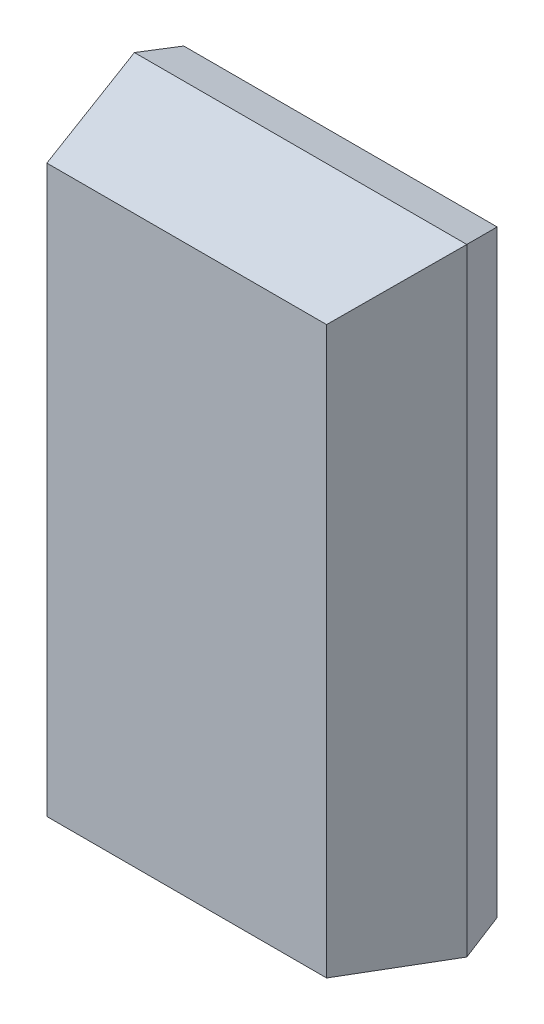
ISO-10303-21;
HEADER;
FILE_DESCRIPTION(('STEP AP214'),'2;1');
FILE_NAME('part.step','',(''),(''),'','','');
FILE_SCHEMA(('AUTOMOTIVE_DESIGN { 1 0 10303 214 1 1 1 1 }'));
ENDSEC;
DATA;
#1=APPLICATION_CONTEXT('core data for automotive mechanical design processes');
#2=APPLICATION_PROTOCOL_DEFINITION('international standard','automotive_design',2000,#1);
#3=PRODUCT_CONTEXT('',#1,'mechanical');
#4=PRODUCT('Part','Part','',(#3));
#5=PRODUCT_RELATED_PRODUCT_CATEGORY('part','',(#4));
#6=PRODUCT_DEFINITION_FORMATION('','',#4);
#7=PRODUCT_DEFINITION_CONTEXT('part definition',#1,'design');
#8=PRODUCT_DEFINITION('design','',#6,#7);
#9=PRODUCT_DEFINITION_SHAPE('','',#8);
#10=(LENGTH_UNIT() NAMED_UNIT(*) SI_UNIT(.MILLI.,.METRE.));
#11=(NAMED_UNIT(*) PLANE_ANGLE_UNIT() SI_UNIT($,.RADIAN.));
#12=(NAMED_UNIT(*) SI_UNIT($,.STERADIAN.) SOLID_ANGLE_UNIT());
#13=UNCERTAINTY_MEASURE_WITH_UNIT(LENGTH_MEASURE(1.E-05),#10,'distance_accuracy_value','');
#14=(GEOMETRIC_REPRESENTATION_CONTEXT(3) GLOBAL_UNCERTAINTY_ASSIGNED_CONTEXT((#13)) GLOBAL_UNIT_ASSIGNED_CONTEXT((#10,
#11,#12)) REPRESENTATION_CONTEXT('',''));
#15=CARTESIAN_POINT('',(0.,0.,0.));
#16=DIRECTION('',(0.,0.,1.));
#17=DIRECTION('',(1.,0.,0.));
#18=AXIS2_PLACEMENT_3D('',#15,#16,#17);
#19=CARTESIAN_POINT('',(24.4948179835691,22.0228286743183,1.63792220718919));
#20=DIRECTION('',(-4.37114089691456E-08,0.,1.));
#21=DIRECTION('',(-1.,-1.19248806385E-08,-4.37114089691456E-08));
#22=AXIS2_PLACEMENT_3D('',#19,#20,#21);
#23=PLANE('',#22);
#24=DIRECTION('',(1.19248806385E-08,-1.,0.));
#25=VECTOR('',#24,1.);
#26=CARTESIAN_POINT('',(23.0250618860082,22.0228286567916,1.63792214294408));
#27=LINE('',#26,#25);
#28=CARTESIAN_POINT('',(23.0250618505536,24.9959993884985,1.63792214294408));
#29=VERTEX_POINT('',#28);
#30=CARTESIAN_POINT('',(23.0250619214629,19.0496579250846,1.63792214294408));
#31=VERTEX_POINT('',#30);
#32=EDGE_CURVE('E162',#29,#31,#27,.T.);
#33=ORIENTED_EDGE('',*,*,#32,.T.);
#34=DIRECTION('',(1.,1.19248806729397E-08,4.3711409122211E-08));
#35=VECTOR('',#34,1.);
#36=CARTESIAN_POINT('',(24.4948180190238,19.0496579426112,1.63792220718919));
#37=LINE('',#36,#35);
#38=CARTESIAN_POINT('',(25.9645741165849,19.0496579601379,1.6379222714343));
#39=VERTEX_POINT('',#38);
#40=EDGE_CURVE('E150',#31,#39,#37,.T.);
#41=ORIENTED_EDGE('',*,*,#40,.T.);
#42=DIRECTION('',(-1.19248806385E-08,1.,0.));
#43=VECTOR('',#42,1.);
#44=CARTESIAN_POINT('',(25.9645740811302,22.0228286918449,1.6379222714343));
#45=LINE('',#44,#43);
#46=CARTESIAN_POINT('',(25.9645740456756,24.9959994235519,1.6379222714343));
#47=VERTEX_POINT('',#46);
#48=EDGE_CURVE('E151',#39,#47,#45,.T.);
#49=ORIENTED_EDGE('',*,*,#48,.T.);
#50=DIRECTION('',(-1.,-1.19248806040603E-08,-4.3711409122211E-08));
#51=VECTOR('',#50,1.);
#52=CARTESIAN_POINT('',(24.4948179481144,24.9959994060252,1.63792220718919));
#53=LINE('',#52,#51);
#54=EDGE_CURVE('E11',#47,#29,#53,.T.);
#55=ORIENTED_EDGE('',*,*,#54,.T.);
#56=EDGE_LOOP('',(#33,#41,#49,#55));
#57=FACE_BOUND('',#56,.T.);
#58=ADVANCED_FACE('F16',(#57),#23,.T.);
#59=CARTESIAN_POINT('',(24.4948179726646,25.1306335523672,1.03954822344919));
#60=DIRECTION('',(2.12292172259081E-08,-0.975609756097571,-0.219512195121903));
#61=DIRECTION('',(-4.00276204744376E-08,-0.219512195121904,0.975609756097571));
#62=AXIS2_PLACEMENT_3D('',#59,#60,#61);
#63=PLANE('',#62);
#64=DIRECTION('',(0.220078264243712,-0.214130238414538,0.951689969792689));
#65=VECTOR('',#64,1.);
#66=CARTESIAN_POINT('',(22.7483139321741,25.2652676778814,0.441174163367039));
#67=LINE('',#66,#65);
#68=CARTESIAN_POINT('',(22.7483139321741,25.2652676778814,0.441174163367039));
#69=VERTEX_POINT('',#68);
#70=EDGE_CURVE('E26',#69,#29,#67,.T.);
#71=ORIENTED_EDGE('',*,*,#70,.T.);
#72=ORIENTED_EDGE('',*,*,#54,.F.);
#73=DIRECTION('',(0.220078342336175,0.214130243663353,-0.951689950552824));
#74=VECTOR('',#73,1.);
#75=CARTESIAN_POINT('',(25.9645740456756,24.9959994235519,1.6379222714343));
#76=LINE('',#75,#74);
#77=CARTESIAN_POINT('',(26.2413220622551,25.265267719535,0.441174316051346));
#78=VERTEX_POINT('',#77);
#79=EDGE_CURVE('E174',#47,#78,#76,.T.);
#80=ORIENTED_EDGE('',*,*,#79,.T.);
#81=DIRECTION('',(1.,1.19248806748228E-08,4.37114091212882E-08));
#82=VECTOR('',#81,1.);
#83=CARTESIAN_POINT('',(24.4948179972149,25.2652676987082,0.441174239709193));
#84=LINE('',#83,#82);
#85=EDGE_CURVE('E135',#69,#78,#84,.T.);
#86=ORIENTED_EDGE('',*,*,#85,.F.);
#87=EDGE_LOOP('',(#71,#72,#80,#86));
#88=FACE_BOUND('',#87,.T.);
#89=ADVANCED_FACE('F204',(#88),#63,.F.);
#90=CARTESIAN_POINT('',(22.886687928424,22.0228286551415,1.03954815315556));
#91=DIRECTION('',(0.974288475353373,1.16182737760551E-08,-0.22530416506048));
#92=DIRECTION('',(0.22530416506048,2.68672527570313E-09,0.974288475353373));
#93=AXIS2_PLACEMENT_3D('',#90,#91,#92);
#94=PLANE('',#93);
#95=DIRECTION('',(0.220078259136756,0.214130243663352,0.951689969792689));
#96=VECTOR('',#95,1.);
#97=CARTESIAN_POINT('',(22.7483140095055,18.7803896291014,0.441174163367039));
#98=LINE('',#97,#96);
#99=CARTESIAN_POINT('',(22.7483140095055,18.7803896291014,0.441174163367039));
#100=VERTEX_POINT('',#99);
#101=EDGE_CURVE('E158',#100,#31,#98,.T.);
#102=ORIENTED_EDGE('',*,*,#101,.T.);
#103=ORIENTED_EDGE('',*,*,#32,.F.);
#104=ORIENTED_EDGE('',*,*,#70,.F.);
#105=DIRECTION('',(-1.19248806385E-08,1.,0.));
#106=VECTOR('',#105,1.);
#107=CARTESIAN_POINT('',(22.7483139708398,22.0228286534913,0.441174163367039));
#108=LINE('',#107,#106);
#109=EDGE_CURVE('E125',#100,#69,#108,.T.);
#110=ORIENTED_EDGE('',*,*,#109,.F.);
#111=EDGE_LOOP('',(#102,#103,#104,#110));
#112=FACE_BOUND('',#111,.T.);
#113=ADVANCED_FACE('F212',(#112),#94,.F.);
#114=CARTESIAN_POINT('',(24.4948180467851,18.9150237962692,1.03954822344919));
#115=DIRECTION('',(-2.03884255653121E-09,0.975609756097571,-0.219512195121903));
#116=DIRECTION('',(4.52629339254852E-08,-0.219512195121903,-0.975609756097571));
#117=AXIS2_PLACEMENT_3D('',#114,#115,#116);
#118=PLANE('',#117);
#119=DIRECTION('',(-0.22007834744313,0.214130238414537,0.951689950552824));
#120=VECTOR('',#119,1.);
#121=CARTESIAN_POINT('',(26.2413221395865,18.7803896707551,0.441174316051346));
#122=LINE('',#121,#120);
#123=CARTESIAN_POINT('',(26.2413221395865,18.7803896707551,0.441174316051346));
#124=VERTEX_POINT('',#123);
#125=EDGE_CURVE('E146',#124,#39,#122,.T.);
#126=ORIENTED_EDGE('',*,*,#125,.T.);
#127=ORIENTED_EDGE('',*,*,#40,.F.);
#128=ORIENTED_EDGE('',*,*,#101,.F.);
#129=DIRECTION('',(-1.,-1.19248806021771E-08,-4.37114091212882E-08));
#130=VECTOR('',#129,1.);
#131=CARTESIAN_POINT('',(24.4948180745463,18.7803896499282,0.441174239709193));
#132=LINE('',#131,#130);
#133=EDGE_CURVE('E91',#124,#100,#132,.T.);
#134=ORIENTED_EDGE('',*,*,#133,.F.);
#135=EDGE_LOOP('',(#126,#127,#128,#134));
#136=FACE_BOUND('',#135,.T.);
#137=ADVANCED_FACE('F216',(#136),#118,.F.);
#138=CARTESIAN_POINT('',(26.102948091026,22.022828693495,1.03954829374282));
#139=DIRECTION('',(-0.974288455656644,-1.1618273541174E-08,-0.225304250235524));
#140=DIRECTION('',(0.225304250235524,2.68672629140536E-09,-0.974288455656644));
#141=AXIS2_PLACEMENT_3D('',#138,#139,#140);
#142=PLANE('',#141);
#143=ORIENTED_EDGE('',*,*,#79,.F.);
#144=ORIENTED_EDGE('',*,*,#48,.F.);
#145=ORIENTED_EDGE('',*,*,#125,.F.);
#146=DIRECTION('',(1.19248806385E-08,-1.,0.));
#147=VECTOR('',#146,1.);
#148=CARTESIAN_POINT('',(26.2413221009208,22.0228286951451,0.441174316051346));
#149=LINE('',#148,#147);
#150=EDGE_CURVE('E86',#78,#124,#149,.T.);
#151=ORIENTED_EDGE('',*,*,#150,.F.);
#152=EDGE_LOOP('',(#143,#144,#145,#151));
#153=FACE_BOUND('',#152,.T.);
#154=ADVANCED_FACE('F201',(#153),#142,.F.);
#155=CARTESIAN_POINT('',(24.4948180069657,25.2152676987082,0.231743345401193));
#156=DIRECTION('',(-1.44841485590508E-09,0.972664234676882,-0.232216034287972));
#157=DIRECTION('',(4.52856727992705E-08,-0.232216034287971,-0.972664234676882));
#158=AXIS2_PLACEMENT_3D('',#155,#156,#157);
#159=PLANE('',#158);
#160=DIRECTION('',(-1.,-1.19248806385E-08,-4.37114089691456E-08));
#161=VECTOR('',#160,1.);
#162=CARTESIAN_POINT('',(24.4948180167165,25.1652676987082,0.0223124510921925));
#163=LINE('',#162,#161);
#164=CARTESIAN_POINT('',(26.1413220817566,25.1652677183426,0.0223125230632053));
#165=VERTEX_POINT('',#164);
#166=CARTESIAN_POINT('',(22.8483139516756,25.1652676790738,0.0223123791211797));
#167=VERTEX_POINT('',#166);
#168=EDGE_CURVE('E99',#165,#167,#163,.T.);
#169=ORIENTED_EDGE('',*,*,#168,.T.);
#170=DIRECTION('',(0.226197386366043,-0.22619733955673,-0.947454223685044));
#171=VECTOR('',#170,1.);
#172=CARTESIAN_POINT('',(22.7483139321741,25.2652676778814,0.441174163367039));
#173=LINE('',#172,#171);
#174=EDGE_CURVE('E132',#69,#167,#173,.T.);
#175=ORIENTED_EDGE('',*,*,#174,.F.);
#176=ORIENTED_EDGE('',*,*,#85,.T.);
#177=DIRECTION('',(0.226197298142171,0.226197344951482,0.947454243459853));
#178=VECTOR('',#177,1.);
#179=CARTESIAN_POINT('',(26.1413220817566,25.1652677183426,0.0223125230632053));
#180=LINE('',#179,#178);
#181=EDGE_CURVE('E101',#165,#78,#180,.T.);
#182=ORIENTED_EDGE('',*,*,#181,.F.);
#183=EDGE_LOOP('',(#169,#175,#176,#182));
#184=FACE_BOUND('',#183,.T.);
#185=ADVANCED_FACE('F207',(#184),#159,.T.);
#186=CARTESIAN_POINT('',(22.7983139799943,22.0228286540876,0.231743271244609));
#187=DIRECTION('',(-0.972664224526392,-1.15989047788164E-08,-0.232216076804496));
#188=DIRECTION('',(0.232216076804496,2.76914899823436E-09,-0.972664224526392));
#189=AXIS2_PLACEMENT_3D('',#186,#187,#188);
#190=PLANE('',#189);
#191=DIRECTION('',(1.19248806385E-08,-1.,0.));
#192=VECTOR('',#191,1.);
#193=CARTESIAN_POINT('',(22.8483139891489,22.0228286546838,0.0223123791211797));
#194=LINE('',#193,#192);
#195=CARTESIAN_POINT('',(22.848314026622,18.8803896302938,0.0223123791211797));
#196=VERTEX_POINT('',#195);
#197=EDGE_CURVE('E108',#167,#196,#194,.T.);
#198=ORIENTED_EDGE('',*,*,#197,.T.);
#199=DIRECTION('',(0.22619738097129,0.226197344951483,-0.947454223685044));
#200=VECTOR('',#199,1.);
#201=CARTESIAN_POINT('',(22.7483140095055,18.7803896291014,0.441174163367039));
#202=LINE('',#201,#200);
#203=EDGE_CURVE('E105',#100,#196,#202,.T.);
#204=ORIENTED_EDGE('',*,*,#203,.F.);
#205=ORIENTED_EDGE('',*,*,#109,.T.);
#206=ORIENTED_EDGE('',*,*,#174,.T.);
#207=EDGE_LOOP('',(#198,#204,#205,#206));
#208=FACE_BOUND('',#207,.T.);
#209=ADVANCED_FACE('F210',(#208),#190,.T.);
#210=CARTESIAN_POINT('',(24.4948180831046,18.8303896499283,0.231743345401193));
#211=DIRECTION('',(2.17493949438145E-08,-0.972664234676882,-0.232216034287972));
#212=DIRECTION('',(-3.97473758168107E-08,-0.232216034287972,0.972664234676882));
#213=AXIS2_PLACEMENT_3D('',#210,#211,#212);
#214=PLANE('',#213);
#215=DIRECTION('',(1.,1.19248806385E-08,4.37114089691456E-08));
#216=VECTOR('',#215,1.);
#217=CARTESIAN_POINT('',(24.4948180916629,18.8803896499282,0.0223124510921925));
#218=LINE('',#217,#216);
#219=CARTESIAN_POINT('',(26.141322156703,18.8803896695626,0.0223125230632053));
#220=VERTEX_POINT('',#219);
#221=EDGE_CURVE('E97',#196,#220,#218,.T.);
#222=ORIENTED_EDGE('',*,*,#221,.T.);
#223=DIRECTION('',(-0.226197303536923,0.226197339556731,-0.947454243459853));
#224=VECTOR('',#223,1.);
#225=CARTESIAN_POINT('',(26.2413221395865,18.7803896707551,0.441174316051346));
#226=LINE('',#225,#224);
#227=EDGE_CURVE('E79',#124,#220,#226,.T.);
#228=ORIENTED_EDGE('',*,*,#227,.F.);
#229=ORIENTED_EDGE('',*,*,#133,.T.);
#230=ORIENTED_EDGE('',*,*,#203,.T.);
#231=EDGE_LOOP('',(#222,#228,#229,#230));
#232=FACE_BOUND('',#231,.T.);
#233=ADVANCED_FACE('F103',(#232),#214,.T.);
#234=CARTESIAN_POINT('',(26.1913221100753,22.0228286945488,0.231743419557775));
#235=DIRECTION('',(0.972664244827372,1.15989050209032E-08,-0.232215991771447));
#236=DIRECTION('',(0.232215991771447,2.76914798422541E-09,0.972664244827372));
#237=AXIS2_PLACEMENT_3D('',#234,#235,#236);
#238=PLANE('',#237);
#239=DIRECTION('',(-1.19248806385E-08,1.,0.));
#240=VECTOR('',#239,1.);
#241=CARTESIAN_POINT('',(26.1413221192299,22.0228286939526,0.0223125230632053));
#242=LINE('',#241,#240);
#243=EDGE_CURVE('E83',#220,#165,#242,.T.);
#244=ORIENTED_EDGE('',*,*,#243,.T.);
#245=ORIENTED_EDGE('',*,*,#181,.T.);
#246=ORIENTED_EDGE('',*,*,#150,.T.);
#247=ORIENTED_EDGE('',*,*,#227,.T.);
#248=EDGE_LOOP('',(#244,#245,#246,#247));
#249=FACE_BOUND('',#248,.T.);
#250=ADVANCED_FACE('F81',(#249),#238,.T.);
#251=CARTESIAN_POINT('',(24.4948180541897,22.0228286743182,0.0223124510921925));
#252=DIRECTION('',(-4.37114089691456E-08,0.,1.));
#253=DIRECTION('',(-1.,-1.19248806385E-08,-4.37114089691456E-08));
#254=AXIS2_PLACEMENT_3D('',#251,#252,#253);
#255=PLANE('',#254);
#256=ORIENTED_EDGE('',*,*,#221,.F.);
#257=ORIENTED_EDGE('',*,*,#197,.F.);
#258=ORIENTED_EDGE('',*,*,#168,.F.);
#259=ORIENTED_EDGE('',*,*,#243,.F.);
#260=EDGE_LOOP('',(#256,#257,#258,#259));
#261=FACE_BOUND('',#260,.T.);
#262=ADVANCED_FACE('F95',(#261),#255,.F.);
#263=CLOSED_SHELL('',(#58,#89,#113,#137,#154,#185,#209,#233,#250,#262));
#264=MANIFOLD_SOLID_BREP('B1',#263);
#265=ADVANCED_BREP_SHAPE_REPRESENTATION('',(#18,#264),#14);
#266=SHAPE_DEFINITION_REPRESENTATION(#9,#265);
ENDSEC;
END-ISO-10303-21;
